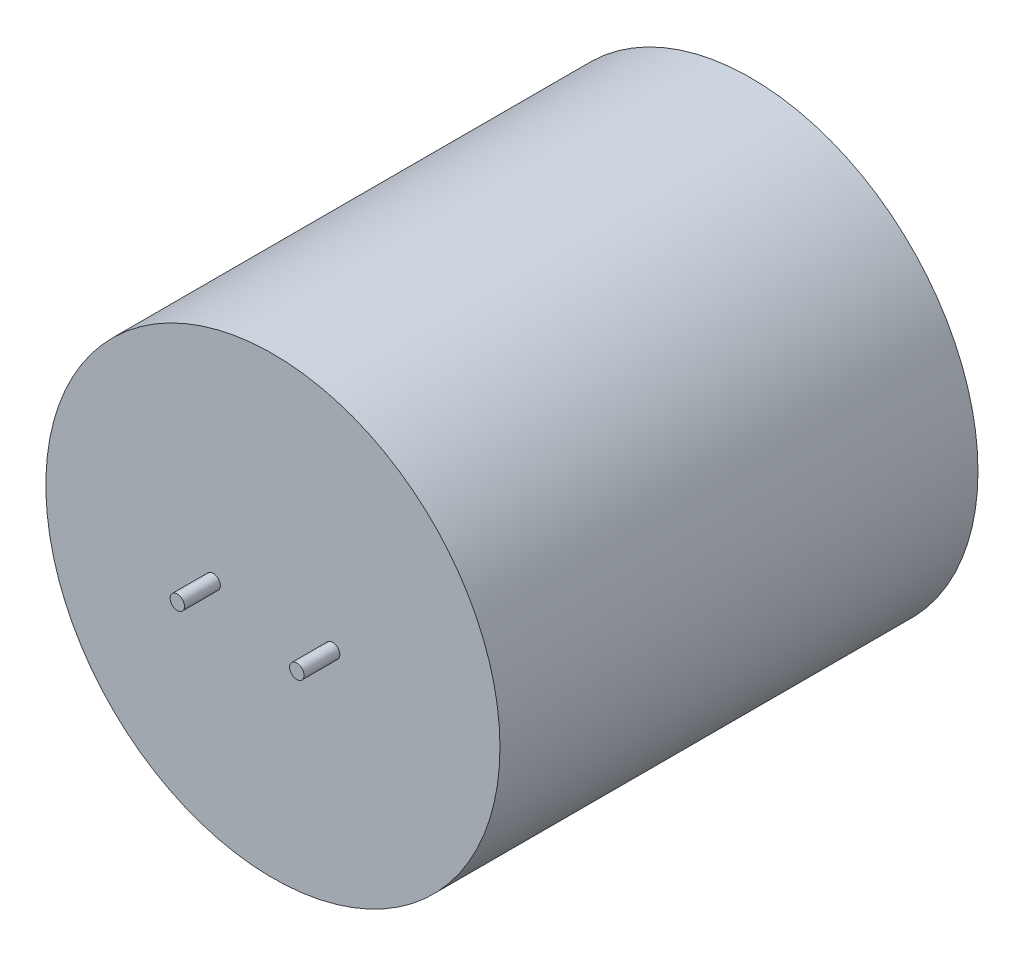
ISO-10303-21;
HEADER;
FILE_DESCRIPTION(('STEP AP214'),'2;1');
FILE_NAME('part.step','',(''),(''),'','','');
FILE_SCHEMA(('AUTOMOTIVE_DESIGN { 1 0 10303 214 1 1 1 1 }'));
ENDSEC;
DATA;
#1=APPLICATION_CONTEXT('core data for automotive mechanical design processes');
#2=APPLICATION_PROTOCOL_DEFINITION('international standard','automotive_design',2000,#1);
#3=PRODUCT_CONTEXT('',#1,'mechanical');
#4=PRODUCT('Part','Part','',(#3));
#5=PRODUCT_RELATED_PRODUCT_CATEGORY('part','',(#4));
#6=PRODUCT_DEFINITION_FORMATION('','',#4);
#7=PRODUCT_DEFINITION_CONTEXT('part definition',#1,'design');
#8=PRODUCT_DEFINITION('design','',#6,#7);
#9=PRODUCT_DEFINITION_SHAPE('','',#8);
#10=(LENGTH_UNIT() NAMED_UNIT(*) SI_UNIT(.MILLI.,.METRE.));
#11=(NAMED_UNIT(*) PLANE_ANGLE_UNIT() SI_UNIT($,.RADIAN.));
#12=(NAMED_UNIT(*) SI_UNIT($,.STERADIAN.) SOLID_ANGLE_UNIT());
#13=UNCERTAINTY_MEASURE_WITH_UNIT(LENGTH_MEASURE(1.E-05),#10,'distance_accuracy_value','');
#14=(GEOMETRIC_REPRESENTATION_CONTEXT(3) GLOBAL_UNCERTAINTY_ASSIGNED_CONTEXT((#13)) GLOBAL_UNIT_ASSIGNED_CONTEXT((#10,
#11,#12)) REPRESENTATION_CONTEXT('',''));
#15=CARTESIAN_POINT('',(0.,0.,0.));
#16=DIRECTION('',(0.,0.,1.));
#17=DIRECTION('',(1.,0.,0.));
#18=AXIS2_PLACEMENT_3D('',#15,#16,#17);
#19=CARTESIAN_POINT('',(0.,0.,40.));
#20=DIRECTION('',(0.,0.,1.));
#21=DIRECTION('',(1.,0.,0.));
#22=AXIS2_PLACEMENT_3D('',#19,#20,#21);
#23=PLANE('',#22);
#24=CARTESIAN_POINT('',(-5.,0.,40.));
#25=DIRECTION('',(0.,0.,1.));
#26=DIRECTION('',(1.,0.,0.));
#27=AXIS2_PLACEMENT_3D('',#24,#25,#26);
#28=CIRCLE('',#27,0.6);
#29=CARTESIAN_POINT('',(-4.4,0.,40.));
#30=VERTEX_POINT('',#29);
#31=EDGE_CURVE('E58',#30,#30,#28,.T.);
#32=ORIENTED_EDGE('',*,*,#31,.F.);
#33=EDGE_LOOP('',(#32));
#34=FACE_BOUND('',#33,.T.);
#35=CARTESIAN_POINT('',(0.,0.,40.));
#36=DIRECTION('',(0.,0.,1.));
#37=DIRECTION('',(1.,0.,0.));
#38=AXIS2_PLACEMENT_3D('',#35,#36,#37);
#39=CIRCLE('',#38,19.);
#40=CARTESIAN_POINT('',(19.,0.,40.));
#41=VERTEX_POINT('',#40);
#42=EDGE_CURVE('E12',#41,#41,#39,.T.);
#43=ORIENTED_EDGE('',*,*,#42,.T.);
#44=EDGE_LOOP('',(#43));
#45=FACE_BOUND('',#44,.T.);
#46=CARTESIAN_POINT('',(5.,0.,40.));
#47=DIRECTION('',(0.,0.,1.));
#48=DIRECTION('',(1.,0.,0.));
#49=AXIS2_PLACEMENT_3D('',#46,#47,#48);
#50=CIRCLE('',#49,0.6);
#51=CARTESIAN_POINT('',(5.6,0.,40.));
#52=VERTEX_POINT('',#51);
#53=EDGE_CURVE('E64',#52,#52,#50,.T.);
#54=ORIENTED_EDGE('',*,*,#53,.F.);
#55=EDGE_LOOP('',(#54));
#56=FACE_BOUND('',#55,.T.);
#57=ADVANCED_FACE('F45',(#34,#45,#56),#23,.T.);
#58=CARTESIAN_POINT('',(0.,0.,40.));
#59=DIRECTION('',(0.,0.,-1.));
#60=DIRECTION('',(-1.,0.,0.));
#61=AXIS2_PLACEMENT_3D('',#58,#59,#60);
#62=CYLINDRICAL_SURFACE('',#61,19.);
#63=ORIENTED_EDGE('',*,*,#42,.F.);
#64=EDGE_LOOP('',(#63));
#65=FACE_BOUND('',#64,.T.);
#66=CARTESIAN_POINT('',(0.,0.,0.));
#67=DIRECTION('',(0.,0.,1.));
#68=DIRECTION('',(1.,0.,0.));
#69=AXIS2_PLACEMENT_3D('',#66,#67,#68);
#70=CIRCLE('',#69,19.);
#71=CARTESIAN_POINT('',(19.,0.,0.));
#72=VERTEX_POINT('',#71);
#73=EDGE_CURVE('E49',#72,#72,#70,.T.);
#74=ORIENTED_EDGE('',*,*,#73,.T.);
#75=EDGE_LOOP('',(#74));
#76=FACE_BOUND('',#75,.T.);
#77=ADVANCED_FACE('F47',(#65,#76),#62,.T.);
#78=CARTESIAN_POINT('',(0.,0.,0.));
#79=DIRECTION('',(0.,0.,1.));
#80=DIRECTION('',(1.,0.,0.));
#81=AXIS2_PLACEMENT_3D('',#78,#79,#80);
#82=PLANE('',#81);
#83=ORIENTED_EDGE('',*,*,#73,.F.);
#84=EDGE_LOOP('',(#83));
#85=FACE_BOUND('',#84,.T.);
#86=ADVANCED_FACE('F85',(#85),#82,.F.);
#87=CARTESIAN_POINT('',(-5.,0.,43.));
#88=DIRECTION('',(0.,0.,-1.));
#89=DIRECTION('',(-1.,0.,0.));
#90=AXIS2_PLACEMENT_3D('',#87,#88,#89);
#91=CYLINDRICAL_SURFACE('',#90,0.6);
#92=CARTESIAN_POINT('',(-5.,0.,43.));
#93=DIRECTION('',(0.,0.,1.));
#94=DIRECTION('',(1.,0.,0.));
#95=AXIS2_PLACEMENT_3D('',#92,#93,#94);
#96=CIRCLE('',#95,0.6);
#97=CARTESIAN_POINT('',(-4.4,0.,43.));
#98=VERTEX_POINT('',#97);
#99=EDGE_CURVE('E56',#98,#98,#96,.T.);
#100=ORIENTED_EDGE('',*,*,#99,.F.);
#101=EDGE_LOOP('',(#100));
#102=FACE_BOUND('',#101,.T.);
#103=ORIENTED_EDGE('',*,*,#31,.T.);
#104=EDGE_LOOP('',(#103));
#105=FACE_BOUND('',#104,.T.);
#106=ADVANCED_FACE('F89',(#102,#105),#91,.T.);
#107=CARTESIAN_POINT('',(-5.,0.,43.));
#108=DIRECTION('',(0.,0.,1.));
#109=DIRECTION('',(1.,0.,0.));
#110=AXIS2_PLACEMENT_3D('',#107,#108,#109);
#111=PLANE('',#110);
#112=ORIENTED_EDGE('',*,*,#99,.T.);
#113=EDGE_LOOP('',(#112));
#114=FACE_BOUND('',#113,.T.);
#115=ADVANCED_FACE('F75',(#114),#111,.T.);
#116=CARTESIAN_POINT('',(5.,0.,43.));
#117=DIRECTION('',(0.,0.,-1.));
#118=DIRECTION('',(-1.,0.,0.));
#119=AXIS2_PLACEMENT_3D('',#116,#117,#118);
#120=CYLINDRICAL_SURFACE('',#119,0.6);
#121=CARTESIAN_POINT('',(5.,0.,43.));
#122=DIRECTION('',(0.,0.,1.));
#123=DIRECTION('',(1.,0.,0.));
#124=AXIS2_PLACEMENT_3D('',#121,#122,#123);
#125=CIRCLE('',#124,0.6);
#126=CARTESIAN_POINT('',(5.6,0.,43.));
#127=VERTEX_POINT('',#126);
#128=EDGE_CURVE('E61',#127,#127,#125,.T.);
#129=ORIENTED_EDGE('',*,*,#128,.F.);
#130=EDGE_LOOP('',(#129));
#131=FACE_BOUND('',#130,.T.);
#132=ORIENTED_EDGE('',*,*,#53,.T.);
#133=EDGE_LOOP('',(#132));
#134=FACE_BOUND('',#133,.T.);
#135=ADVANCED_FACE('F72',(#131,#134),#120,.T.);
#136=CARTESIAN_POINT('',(5.,0.,43.));
#137=DIRECTION('',(0.,0.,1.));
#138=DIRECTION('',(1.,0.,0.));
#139=AXIS2_PLACEMENT_3D('',#136,#137,#138);
#140=PLANE('',#139);
#141=ORIENTED_EDGE('',*,*,#128,.T.);
#142=EDGE_LOOP('',(#141));
#143=FACE_BOUND('',#142,.T.);
#144=ADVANCED_FACE('F70',(#143),#140,.T.);
#145=CLOSED_SHELL('',(#57,#77,#86,#106,#115,#135,#144));
#146=MANIFOLD_SOLID_BREP('B2',#145);
#147=ADVANCED_BREP_SHAPE_REPRESENTATION('',(#18,#146),#14);
#148=SHAPE_DEFINITION_REPRESENTATION(#9,#147);
ENDSEC;
END-ISO-10303-21;
